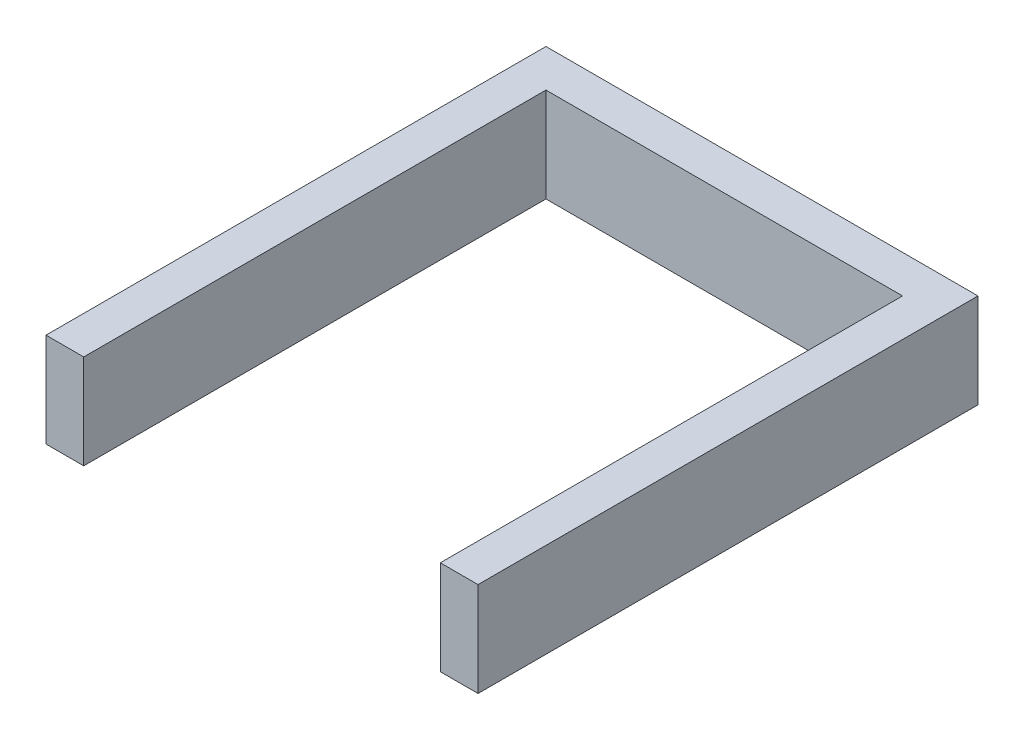
ISO-10303-21;
HEADER;
FILE_DESCRIPTION(('STEP AP214'),'2;1');
FILE_NAME('part.step','',(''),(''),'','','');
FILE_SCHEMA(('AUTOMOTIVE_DESIGN { 1 0 10303 214 1 1 1 1 }'));
ENDSEC;
DATA;
#1=APPLICATION_CONTEXT('core data for automotive mechanical design processes');
#2=APPLICATION_PROTOCOL_DEFINITION('international standard','automotive_design',2000,#1);
#3=PRODUCT_CONTEXT('',#1,'mechanical');
#4=PRODUCT('Part','Part','',(#3));
#5=PRODUCT_RELATED_PRODUCT_CATEGORY('part','',(#4));
#6=PRODUCT_DEFINITION_FORMATION('','',#4);
#7=PRODUCT_DEFINITION_CONTEXT('part definition',#1,'design');
#8=PRODUCT_DEFINITION('design','',#6,#7);
#9=PRODUCT_DEFINITION_SHAPE('','',#8);
#10=(LENGTH_UNIT() NAMED_UNIT(*) SI_UNIT(.MILLI.,.METRE.));
#11=(NAMED_UNIT(*) PLANE_ANGLE_UNIT() SI_UNIT($,.RADIAN.));
#12=(NAMED_UNIT(*) SI_UNIT($,.STERADIAN.) SOLID_ANGLE_UNIT());
#13=UNCERTAINTY_MEASURE_WITH_UNIT(LENGTH_MEASURE(1.E-05),#10,'distance_accuracy_value','');
#14=(GEOMETRIC_REPRESENTATION_CONTEXT(3) GLOBAL_UNCERTAINTY_ASSIGNED_CONTEXT((#13)) GLOBAL_UNIT_ASSIGNED_CONTEXT((#10,
#11,#12)) REPRESENTATION_CONTEXT('',''));
#15=CARTESIAN_POINT('',(0.,0.,0.));
#16=DIRECTION('',(0.,0.,1.));
#17=DIRECTION('',(1.,0.,0.));
#18=AXIS2_PLACEMENT_3D('',#15,#16,#17);
#19=CARTESIAN_POINT('',(-2.,5.,0.));
#20=DIRECTION('',(0.,0.,-1.));
#21=DIRECTION('',(-1.,0.,0.));
#22=AXIS2_PLACEMENT_3D('',#19,#20,#21);
#23=PLANE('',#22);
#24=DIRECTION('',(1.,0.,0.));
#25=VECTOR('',#24,1.);
#26=CARTESIAN_POINT('',(-2.,0.,0.));
#27=LINE('',#26,#25);
#28=CARTESIAN_POINT('',(-2.,0.,0.));
#29=VERTEX_POINT('',#28);
#30=CARTESIAN_POINT('',(0.,0.,0.));
#31=VERTEX_POINT('',#30);
#32=EDGE_CURVE('E146',#29,#31,#27,.T.);
#33=ORIENTED_EDGE('',*,*,#32,.T.);
#34=DIRECTION('',(0.,-1.,0.));
#35=VECTOR('',#34,1.);
#36=CARTESIAN_POINT('',(0.,5.,0.));
#37=LINE('',#36,#35);
#38=CARTESIAN_POINT('',(0.,5.,0.));
#39=VERTEX_POINT('',#38);
#40=EDGE_CURVE('E11',#39,#31,#37,.T.);
#41=ORIENTED_EDGE('',*,*,#40,.F.);
#42=DIRECTION('',(1.,0.,0.));
#43=VECTOR('',#42,1.);
#44=CARTESIAN_POINT('',(-2.,5.,0.));
#45=LINE('',#44,#43);
#46=CARTESIAN_POINT('',(-2.,5.,0.));
#47=VERTEX_POINT('',#46);
#48=EDGE_CURVE('E168',#47,#39,#45,.T.);
#49=ORIENTED_EDGE('',*,*,#48,.F.);
#50=DIRECTION('',(0.,-1.,0.));
#51=VECTOR('',#50,1.);
#52=CARTESIAN_POINT('',(-2.,5.,0.));
#53=LINE('',#52,#51);
#54=EDGE_CURVE('E142',#47,#29,#53,.T.);
#55=ORIENTED_EDGE('',*,*,#54,.T.);
#56=EDGE_LOOP('',(#33,#41,#49,#55));
#57=FACE_BOUND('',#56,.T.);
#58=ADVANCED_FACE('F45',(#57),#23,.F.);
#59=CARTESIAN_POINT('',(0.,5.,0.));
#60=DIRECTION('',(-1.,0.,0.));
#61=DIRECTION('',(0.,0.,1.));
#62=AXIS2_PLACEMENT_3D('',#59,#60,#61);
#63=PLANE('',#62);
#64=DIRECTION('',(0.,0.,-1.));
#65=VECTOR('',#64,1.);
#66=CARTESIAN_POINT('',(0.,0.,0.));
#67=LINE('',#66,#65);
#68=CARTESIAN_POINT('',(0.,0.,-24.5));
#69=VERTEX_POINT('',#68);
#70=EDGE_CURVE('E150',#31,#69,#67,.T.);
#71=ORIENTED_EDGE('',*,*,#70,.T.);
#72=DIRECTION('',(0.,-1.,0.));
#73=VECTOR('',#72,1.);
#74=CARTESIAN_POINT('',(0.,5.,-24.5));
#75=LINE('',#74,#73);
#76=CARTESIAN_POINT('',(0.,5.,-24.5));
#77=VERTEX_POINT('',#76);
#78=EDGE_CURVE('E54',#77,#69,#75,.T.);
#79=ORIENTED_EDGE('',*,*,#78,.F.);
#80=DIRECTION('',(0.,0.,-1.));
#81=VECTOR('',#80,1.);
#82=CARTESIAN_POINT('',(0.,5.,0.));
#83=LINE('',#82,#81);
#84=EDGE_CURVE('E105',#39,#77,#83,.T.);
#85=ORIENTED_EDGE('',*,*,#84,.F.);
#86=ORIENTED_EDGE('',*,*,#40,.T.);
#87=EDGE_LOOP('',(#71,#79,#85,#86));
#88=FACE_BOUND('',#87,.T.);
#89=ADVANCED_FACE('F214',(#88),#63,.F.);
#90=CARTESIAN_POINT('',(0.,5.,-24.5));
#91=DIRECTION('',(0.,0.,-1.));
#92=DIRECTION('',(-1.,0.,0.));
#93=AXIS2_PLACEMENT_3D('',#90,#91,#92);
#94=PLANE('',#93);
#95=DIRECTION('',(1.,0.,0.));
#96=VECTOR('',#95,1.);
#97=CARTESIAN_POINT('',(0.,0.,-24.5));
#98=LINE('',#97,#96);
#99=CARTESIAN_POINT('',(18.9,0.,-24.5));
#100=VERTEX_POINT('',#99);
#101=EDGE_CURVE('E153',#69,#100,#98,.T.);
#102=ORIENTED_EDGE('',*,*,#101,.T.);
#103=DIRECTION('',(0.,-1.,0.));
#104=VECTOR('',#103,1.);
#105=CARTESIAN_POINT('',(18.9,5.,-24.5));
#106=LINE('',#105,#104);
#107=CARTESIAN_POINT('',(18.9,5.,-24.5));
#108=VERTEX_POINT('',#107);
#109=EDGE_CURVE('E179',#108,#100,#106,.T.);
#110=ORIENTED_EDGE('',*,*,#109,.F.);
#111=DIRECTION('',(1.,0.,0.));
#112=VECTOR('',#111,1.);
#113=CARTESIAN_POINT('',(0.,5.,-24.5));
#114=LINE('',#113,#112);
#115=EDGE_CURVE('E189',#77,#108,#114,.T.);
#116=ORIENTED_EDGE('',*,*,#115,.F.);
#117=ORIENTED_EDGE('',*,*,#78,.T.);
#118=EDGE_LOOP('',(#102,#110,#116,#117));
#119=FACE_BOUND('',#118,.T.);
#120=ADVANCED_FACE('F187',(#119),#94,.F.);
#121=CARTESIAN_POINT('',(18.9,5.,0.));
#122=DIRECTION('',(1.,0.,0.));
#123=DIRECTION('',(0.,0.,-1.));
#124=AXIS2_PLACEMENT_3D('',#121,#122,#123);
#125=PLANE('',#124);
#126=DIRECTION('',(0.,0.,1.));
#127=VECTOR('',#126,1.);
#128=CARTESIAN_POINT('',(18.9,0.,0.));
#129=LINE('',#128,#127);
#130=CARTESIAN_POINT('',(18.9,0.,0.));
#131=VERTEX_POINT('',#130);
#132=EDGE_CURVE('E156',#100,#131,#129,.T.);
#133=ORIENTED_EDGE('',*,*,#132,.T.);
#134=DIRECTION('',(0.,-1.,0.));
#135=VECTOR('',#134,1.);
#136=CARTESIAN_POINT('',(18.9,5.,0.));
#137=LINE('',#136,#135);
#138=CARTESIAN_POINT('',(18.9,5.,0.));
#139=VERTEX_POINT('',#138);
#140=EDGE_CURVE('E175',#139,#131,#137,.T.);
#141=ORIENTED_EDGE('',*,*,#140,.F.);
#142=DIRECTION('',(0.,0.,1.));
#143=VECTOR('',#142,1.);
#144=CARTESIAN_POINT('',(18.9,5.,0.));
#145=LINE('',#144,#143);
#146=EDGE_CURVE('E202',#108,#139,#145,.T.);
#147=ORIENTED_EDGE('',*,*,#146,.F.);
#148=ORIENTED_EDGE('',*,*,#109,.T.);
#149=EDGE_LOOP('',(#133,#141,#147,#148));
#150=FACE_BOUND('',#149,.T.);
#151=ADVANCED_FACE('F197',(#150),#125,.F.);
#152=CARTESIAN_POINT('',(18.9,5.,0.));
#153=DIRECTION('',(0.,0.,-1.));
#154=DIRECTION('',(-1.,0.,0.));
#155=AXIS2_PLACEMENT_3D('',#152,#153,#154);
#156=PLANE('',#155);
#157=DIRECTION('',(1.,0.,0.));
#158=VECTOR('',#157,1.);
#159=CARTESIAN_POINT('',(18.9,0.,0.));
#160=LINE('',#159,#158);
#161=CARTESIAN_POINT('',(20.9,0.,0.));
#162=VERTEX_POINT('',#161);
#163=EDGE_CURVE('E159',#131,#162,#160,.T.);
#164=ORIENTED_EDGE('',*,*,#163,.T.);
#165=DIRECTION('',(0.,-1.,0.));
#166=VECTOR('',#165,1.);
#167=CARTESIAN_POINT('',(20.9,5.,0.));
#168=LINE('',#167,#166);
#169=CARTESIAN_POINT('',(20.9,5.,0.));
#170=VERTEX_POINT('',#169);
#171=EDGE_CURVE('E135',#170,#162,#168,.T.);
#172=ORIENTED_EDGE('',*,*,#171,.F.);
#173=DIRECTION('',(1.,0.,0.));
#174=VECTOR('',#173,1.);
#175=CARTESIAN_POINT('',(18.9,5.,0.));
#176=LINE('',#175,#174);
#177=EDGE_CURVE('E124',#139,#170,#176,.T.);
#178=ORIENTED_EDGE('',*,*,#177,.F.);
#179=ORIENTED_EDGE('',*,*,#140,.T.);
#180=EDGE_LOOP('',(#164,#172,#178,#179));
#181=FACE_BOUND('',#180,.T.);
#182=ADVANCED_FACE('F200',(#181),#156,.F.);
#183=CARTESIAN_POINT('',(20.9,5.,0.));
#184=DIRECTION('',(-1.,0.,0.));
#185=DIRECTION('',(0.,0.,1.));
#186=AXIS2_PLACEMENT_3D('',#183,#184,#185);
#187=PLANE('',#186);
#188=DIRECTION('',(0.,0.,-1.));
#189=VECTOR('',#188,1.);
#190=CARTESIAN_POINT('',(20.9,0.,0.));
#191=LINE('',#190,#189);
#192=CARTESIAN_POINT('',(20.9,0.,-26.5));
#193=VERTEX_POINT('',#192);
#194=EDGE_CURVE('E133',#162,#193,#191,.T.);
#195=ORIENTED_EDGE('',*,*,#194,.T.);
#196=DIRECTION('',(0.,-1.,0.));
#197=VECTOR('',#196,1.);
#198=CARTESIAN_POINT('',(20.9,5.,-26.5));
#199=LINE('',#198,#197);
#200=CARTESIAN_POINT('',(20.9,5.,-26.5));
#201=VERTEX_POINT('',#200);
#202=EDGE_CURVE('E130',#201,#193,#199,.T.);
#203=ORIENTED_EDGE('',*,*,#202,.F.);
#204=DIRECTION('',(0.,0.,-1.));
#205=VECTOR('',#204,1.);
#206=CARTESIAN_POINT('',(20.9,5.,0.));
#207=LINE('',#206,#205);
#208=EDGE_CURVE('E118',#170,#201,#207,.T.);
#209=ORIENTED_EDGE('',*,*,#208,.F.);
#210=ORIENTED_EDGE('',*,*,#171,.T.);
#211=EDGE_LOOP('',(#195,#203,#209,#210));
#212=FACE_BOUND('',#211,.T.);
#213=ADVANCED_FACE('F131',(#212),#187,.F.);
#214=CARTESIAN_POINT('',(-2.,5.,-26.5));
#215=DIRECTION('',(0.,0.,1.));
#216=DIRECTION('',(1.,0.,0.));
#217=AXIS2_PLACEMENT_3D('',#214,#215,#216);
#218=PLANE('',#217);
#219=DIRECTION('',(-1.,0.,0.));
#220=VECTOR('',#219,1.);
#221=CARTESIAN_POINT('',(-2.,0.,-26.5));
#222=LINE('',#221,#220);
#223=CARTESIAN_POINT('',(-2.,0.,-26.5));
#224=VERTEX_POINT('',#223);
#225=EDGE_CURVE('E91',#193,#224,#222,.T.);
#226=ORIENTED_EDGE('',*,*,#225,.T.);
#227=DIRECTION('',(0.,-1.,0.));
#228=VECTOR('',#227,1.);
#229=CARTESIAN_POINT('',(-2.,5.,-26.5));
#230=LINE('',#229,#228);
#231=CARTESIAN_POINT('',(-2.,5.,-26.5));
#232=VERTEX_POINT('',#231);
#233=EDGE_CURVE('E136',#232,#224,#230,.T.);
#234=ORIENTED_EDGE('',*,*,#233,.F.);
#235=DIRECTION('',(-1.,0.,0.));
#236=VECTOR('',#235,1.);
#237=CARTESIAN_POINT('',(-2.,5.,-26.5));
#238=LINE('',#237,#236);
#239=EDGE_CURVE('E122',#201,#232,#238,.T.);
#240=ORIENTED_EDGE('',*,*,#239,.F.);
#241=ORIENTED_EDGE('',*,*,#202,.T.);
#242=EDGE_LOOP('',(#226,#234,#240,#241));
#243=FACE_BOUND('',#242,.T.);
#244=ADVANCED_FACE('F138',(#243),#218,.F.);
#245=CARTESIAN_POINT('',(-2.,5.,0.));
#246=DIRECTION('',(1.,0.,0.));
#247=DIRECTION('',(0.,0.,-1.));
#248=AXIS2_PLACEMENT_3D('',#245,#246,#247);
#249=PLANE('',#248);
#250=DIRECTION('',(0.,0.,1.));
#251=VECTOR('',#250,1.);
#252=CARTESIAN_POINT('',(-2.,0.,0.));
#253=LINE('',#252,#251);
#254=EDGE_CURVE('E97',#224,#29,#253,.T.);
#255=ORIENTED_EDGE('',*,*,#254,.T.);
#256=ORIENTED_EDGE('',*,*,#54,.F.);
#257=DIRECTION('',(0.,0.,1.));
#258=VECTOR('',#257,1.);
#259=CARTESIAN_POINT('',(-2.,5.,0.));
#260=LINE('',#259,#258);
#261=EDGE_CURVE('E62',#232,#47,#260,.T.);
#262=ORIENTED_EDGE('',*,*,#261,.F.);
#263=ORIENTED_EDGE('',*,*,#233,.T.);
#264=EDGE_LOOP('',(#255,#256,#262,#263));
#265=FACE_BOUND('',#264,.T.);
#266=ADVANCED_FACE('F230',(#265),#249,.F.);
#267=CARTESIAN_POINT('',(0.,5.,0.));
#268=DIRECTION('',(0.,1.,0.));
#269=DIRECTION('',(0.,0.,1.));
#270=AXIS2_PLACEMENT_3D('',#267,#268,#269);
#271=PLANE('',#270);
#272=ORIENTED_EDGE('',*,*,#48,.T.);
#273=ORIENTED_EDGE('',*,*,#84,.T.);
#274=ORIENTED_EDGE('',*,*,#115,.T.);
#275=ORIENTED_EDGE('',*,*,#146,.T.);
#276=ORIENTED_EDGE('',*,*,#177,.T.);
#277=ORIENTED_EDGE('',*,*,#208,.T.);
#278=ORIENTED_EDGE('',*,*,#239,.T.);
#279=ORIENTED_EDGE('',*,*,#261,.T.);
#280=EDGE_LOOP('',(#272,#273,#274,#275,#276,#277,#278,#279));
#281=FACE_BOUND('',#280,.T.);
#282=ADVANCED_FACE('F120',(#281),#271,.T.);
#283=CARTESIAN_POINT('',(0.,0.,0.));
#284=DIRECTION('',(0.,1.,0.));
#285=DIRECTION('',(0.,0.,1.));
#286=AXIS2_PLACEMENT_3D('',#283,#284,#285);
#287=PLANE('',#286);
#288=ORIENTED_EDGE('',*,*,#32,.F.);
#289=ORIENTED_EDGE('',*,*,#254,.F.);
#290=ORIENTED_EDGE('',*,*,#225,.F.);
#291=ORIENTED_EDGE('',*,*,#194,.F.);
#292=ORIENTED_EDGE('',*,*,#163,.F.);
#293=ORIENTED_EDGE('',*,*,#132,.F.);
#294=ORIENTED_EDGE('',*,*,#101,.F.);
#295=ORIENTED_EDGE('',*,*,#70,.F.);
#296=EDGE_LOOP('',(#288,#289,#290,#291,#292,#293,#294,#295));
#297=FACE_BOUND('',#296,.T.);
#298=ADVANCED_FACE('F193',(#297),#287,.F.);
#299=CLOSED_SHELL('',(#58,#89,#120,#151,#182,#213,#244,#266,#282,#298));
#300=MANIFOLD_SOLID_BREP('B2',#299);
#301=ADVANCED_BREP_SHAPE_REPRESENTATION('',(#18,#300),#14);
#302=SHAPE_DEFINITION_REPRESENTATION(#9,#301);
ENDSEC;
END-ISO-10303-21;
